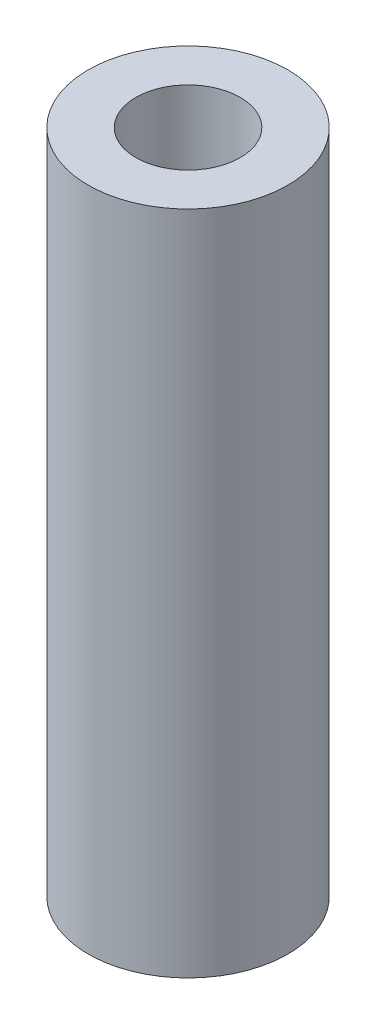
ISO-10303-21;
HEADER;
FILE_DESCRIPTION(('STEP AP214'),'2;1');
FILE_NAME('part.step','',(''),(''),'','','');
FILE_SCHEMA(('AUTOMOTIVE_DESIGN { 1 0 10303 214 1 1 1 1 }'));
ENDSEC;
DATA;
#1=APPLICATION_CONTEXT('core data for automotive mechanical design processes');
#2=APPLICATION_PROTOCOL_DEFINITION('international standard','automotive_design',2000,#1);
#3=PRODUCT_CONTEXT('',#1,'mechanical');
#4=PRODUCT('Part','Part','',(#3));
#5=PRODUCT_RELATED_PRODUCT_CATEGORY('part','',(#4));
#6=PRODUCT_DEFINITION_FORMATION('','',#4);
#7=PRODUCT_DEFINITION_CONTEXT('part definition',#1,'design');
#8=PRODUCT_DEFINITION('design','',#6,#7);
#9=PRODUCT_DEFINITION_SHAPE('','',#8);
#10=(LENGTH_UNIT() NAMED_UNIT(*) SI_UNIT(.MILLI.,.METRE.));
#11=(NAMED_UNIT(*) PLANE_ANGLE_UNIT() SI_UNIT($,.RADIAN.));
#12=(NAMED_UNIT(*) SI_UNIT($,.STERADIAN.) SOLID_ANGLE_UNIT());
#13=UNCERTAINTY_MEASURE_WITH_UNIT(LENGTH_MEASURE(1.E-05),#10,'distance_accuracy_value','');
#14=(GEOMETRIC_REPRESENTATION_CONTEXT(3) GLOBAL_UNCERTAINTY_ASSIGNED_CONTEXT((#13)) GLOBAL_UNIT_ASSIGNED_CONTEXT((#10,
#11,#12)) REPRESENTATION_CONTEXT('',''));
#15=CARTESIAN_POINT('',(0.,0.,0.));
#16=DIRECTION('',(0.,0.,1.));
#17=DIRECTION('',(1.,0.,0.));
#18=AXIS2_PLACEMENT_3D('',#15,#16,#17);
#19=CARTESIAN_POINT('',(0.,-14.2875,0.));
#20=DIRECTION('',(0.,1.,0.));
#21=DIRECTION('',(0.,0.,1.));
#22=AXIS2_PLACEMENT_3D('',#19,#20,#21);
#23=CYLINDRICAL_SURFACE('',#22,2.4892);
#24=CARTESIAN_POINT('',(0.,14.2875,0.));
#25=DIRECTION('',(0.,-1.,0.));
#26=DIRECTION('',(0.,0.,-1.));
#27=AXIS2_PLACEMENT_3D('',#24,#25,#26);
#28=CIRCLE('',#27,2.4892);
#29=CARTESIAN_POINT('',(0.,14.2875,-2.4892));
#30=VERTEX_POINT('',#29);
#31=EDGE_CURVE('E41',#30,#30,#28,.T.);
#32=ORIENTED_EDGE('',*,*,#31,.F.);
#33=EDGE_LOOP('',(#32));
#34=FACE_BOUND('',#33,.T.);
#35=CARTESIAN_POINT('',(0.,-17.4625,0.));
#36=DIRECTION('',(0.,-1.,0.));
#37=DIRECTION('',(0.,0.,-1.));
#38=AXIS2_PLACEMENT_3D('',#35,#36,#37);
#39=CIRCLE('',#38,2.4892);
#40=CARTESIAN_POINT('',(0.,-17.4625,-2.4892));
#41=VERTEX_POINT('',#40);
#42=EDGE_CURVE('E49',#41,#41,#39,.T.);
#43=ORIENTED_EDGE('',*,*,#42,.T.);
#44=EDGE_LOOP('',(#43));
#45=FACE_BOUND('',#44,.T.);
#46=ADVANCED_FACE('F35',(#34,#45),#23,.F.);
#47=CARTESIAN_POINT('',(0.,-14.2875,0.));
#48=DIRECTION('',(0.,1.,0.));
#49=DIRECTION('',(0.,0.,1.));
#50=AXIS2_PLACEMENT_3D('',#47,#48,#49);
#51=CYLINDRICAL_SURFACE('',#50,4.7625);
#52=CARTESIAN_POINT('',(0.,14.2875,0.));
#53=DIRECTION('',(0.,-1.,0.));
#54=DIRECTION('',(0.,0.,-1.));
#55=AXIS2_PLACEMENT_3D('',#52,#53,#54);
#56=CIRCLE('',#55,4.7625);
#57=CARTESIAN_POINT('',(0.,14.2875,-4.7625));
#58=VERTEX_POINT('',#57);
#59=EDGE_CURVE('E10',#58,#58,#56,.T.);
#60=ORIENTED_EDGE('',*,*,#59,.T.);
#61=EDGE_LOOP('',(#60));
#62=FACE_BOUND('',#61,.T.);
#63=CARTESIAN_POINT('',(0.,-17.4625,0.));
#64=DIRECTION('',(0.,-1.,0.));
#65=DIRECTION('',(0.,0.,-1.));
#66=AXIS2_PLACEMENT_3D('',#63,#64,#65);
#67=CIRCLE('',#66,4.7625);
#68=CARTESIAN_POINT('',(0.,-17.4625,-4.7625));
#69=VERTEX_POINT('',#68);
#70=EDGE_CURVE('E45',#69,#69,#67,.T.);
#71=ORIENTED_EDGE('',*,*,#70,.F.);
#72=EDGE_LOOP('',(#71));
#73=FACE_BOUND('',#72,.T.);
#74=ADVANCED_FACE('F64',(#62,#73),#51,.T.);
#75=CARTESIAN_POINT('',(0.,14.2875,0.));
#76=DIRECTION('',(0.,-1.,0.));
#77=DIRECTION('',(1.,0.,0.));
#78=AXIS2_PLACEMENT_3D('',#75,#76,#77);
#79=PLANE('',#78);
#80=ORIENTED_EDGE('',*,*,#31,.T.);
#81=EDGE_LOOP('',(#80));
#82=FACE_BOUND('',#81,.T.);
#83=ORIENTED_EDGE('',*,*,#59,.F.);
#84=EDGE_LOOP('',(#83));
#85=FACE_BOUND('',#84,.T.);
#86=ADVANCED_FACE('F58',(#82,#85),#79,.F.);
#87=CARTESIAN_POINT('',(0.,-17.4625,0.));
#88=DIRECTION('',(0.,-1.,0.));
#89=DIRECTION('',(0.,0.,-1.));
#90=AXIS2_PLACEMENT_3D('',#87,#88,#89);
#91=PLANE('',#90);
#92=ORIENTED_EDGE('',*,*,#70,.T.);
#93=EDGE_LOOP('',(#92));
#94=FACE_BOUND('',#93,.T.);
#95=ORIENTED_EDGE('',*,*,#42,.F.);
#96=EDGE_LOOP('',(#95));
#97=FACE_BOUND('',#96,.T.);
#98=ADVANCED_FACE('F56',(#94,#97),#91,.T.);
#99=CLOSED_SHELL('',(#46,#74,#86,#98));
#100=MANIFOLD_SOLID_BREP('B2',#99);
#101=ADVANCED_BREP_SHAPE_REPRESENTATION('',(#18,#100),#14);
#102=SHAPE_DEFINITION_REPRESENTATION(#9,#101);
ENDSEC;
END-ISO-10303-21;
